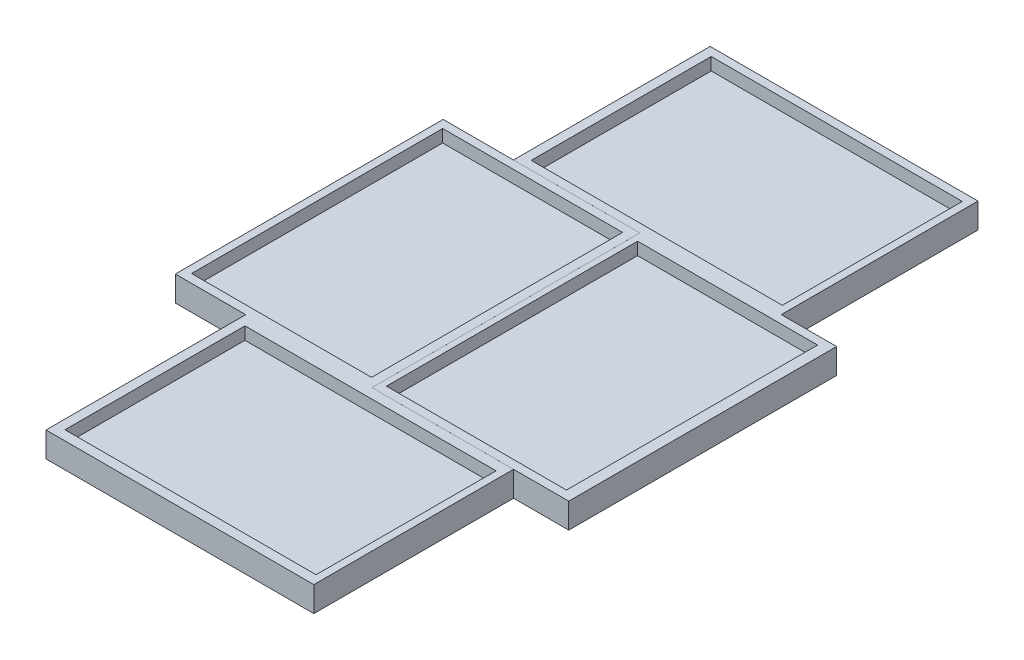
ISO-10303-21;
HEADER;
FILE_DESCRIPTION(('STEP AP214'),'2;1');
FILE_NAME('part.step','',(''),(''),'','','');
FILE_SCHEMA(('AUTOMOTIVE_DESIGN { 1 0 10303 214 1 1 1 1 }'));
ENDSEC;
DATA;
#1=APPLICATION_CONTEXT('core data for automotive mechanical design processes');
#2=APPLICATION_PROTOCOL_DEFINITION('international standard','automotive_design',2000,#1);
#3=PRODUCT_CONTEXT('',#1,'mechanical');
#4=PRODUCT('Part','Part','',(#3));
#5=PRODUCT_RELATED_PRODUCT_CATEGORY('part','',(#4));
#6=PRODUCT_DEFINITION_FORMATION('','',#4);
#7=PRODUCT_DEFINITION_CONTEXT('part definition',#1,'design');
#8=PRODUCT_DEFINITION('design','',#6,#7);
#9=PRODUCT_DEFINITION_SHAPE('','',#8);
#10=(LENGTH_UNIT() NAMED_UNIT(*) SI_UNIT(.MILLI.,.METRE.));
#11=(NAMED_UNIT(*) PLANE_ANGLE_UNIT() SI_UNIT($,.RADIAN.));
#12=(NAMED_UNIT(*) SI_UNIT($,.STERADIAN.) SOLID_ANGLE_UNIT());
#13=UNCERTAINTY_MEASURE_WITH_UNIT(LENGTH_MEASURE(1.E-05),#10,'distance_accuracy_value','');
#14=(GEOMETRIC_REPRESENTATION_CONTEXT(3) GLOBAL_UNCERTAINTY_ASSIGNED_CONTEXT((#13)) GLOBAL_UNIT_ASSIGNED_CONTEXT((#10,
#11,#12)) REPRESENTATION_CONTEXT('',''));
#15=CARTESIAN_POINT('',(0.,0.,0.));
#16=DIRECTION('',(0.,0.,1.));
#17=DIRECTION('',(1.,0.,0.));
#18=AXIS2_PLACEMENT_3D('',#15,#16,#17);
#19=CARTESIAN_POINT('',(36.3335021204187,6.,0.));
#20=DIRECTION('',(1.,0.,0.));
#21=DIRECTION('',(0.,0.,-1.));
#22=AXIS2_PLACEMENT_3D('',#19,#20,#21);
#23=PLANE('',#22);
#24=DIRECTION('',(0.,0.,1.));
#25=VECTOR('',#24,1.);
#26=CARTESIAN_POINT('',(36.3335021204187,0.,0.));
#27=LINE('',#26,#25);
#28=CARTESIAN_POINT('',(36.3335021204187,0.,52.00456736409));
#29=VERTEX_POINT('',#28);
#30=CARTESIAN_POINT('',(36.3335021204187,0.,99.7238307242931));
#31=VERTEX_POINT('',#30);
#32=EDGE_CURVE('E303',#29,#31,#27,.T.);
#33=ORIENTED_EDGE('',*,*,#32,.F.);
#34=DIRECTION('',(0.,-1.,0.));
#35=VECTOR('',#34,1.);
#36=CARTESIAN_POINT('',(36.3335021204187,6.,52.00456736409));
#37=LINE('',#36,#35);
#38=CARTESIAN_POINT('',(36.3335021204187,6.,52.00456736409));
#39=VERTEX_POINT('',#38);
#40=EDGE_CURVE('E298',#39,#29,#37,.T.);
#41=ORIENTED_EDGE('',*,*,#40,.F.);
#42=DIRECTION('',(0.,0.,1.));
#43=VECTOR('',#42,1.);
#44=CARTESIAN_POINT('',(36.3335021204187,6.,0.));
#45=LINE('',#44,#43);
#46=CARTESIAN_POINT('',(36.3335021204187,6.,99.7238307242931));
#47=VERTEX_POINT('',#46);
#48=EDGE_CURVE('E91',#39,#47,#45,.T.);
#49=ORIENTED_EDGE('',*,*,#48,.T.);
#50=DIRECTION('',(0.,-1.,0.));
#51=VECTOR('',#50,1.);
#52=CARTESIAN_POINT('',(36.3335021204187,6.,99.7238307242931));
#53=LINE('',#52,#51);
#54=EDGE_CURVE('E345',#47,#31,#53,.T.);
#55=ORIENTED_EDGE('',*,*,#54,.T.);
#56=EDGE_LOOP('',(#33,#41,#49,#55));
#57=FACE_BOUND('',#56,.T.);
#58=ADVANCED_FACE('F87',(#57),#23,.T.);
#59=CARTESIAN_POINT('',(0.,6.,52.00456736409));
#60=DIRECTION('',(0.,0.,-1.));
#61=DIRECTION('',(-1.,0.,0.));
#62=AXIS2_PLACEMENT_3D('',#59,#60,#61);
#63=PLANE('',#62);
#64=DIRECTION('',(0.,-1.,0.));
#65=VECTOR('',#64,1.);
#66=CARTESIAN_POINT('',(2.51742848786307,6.,52.00456736409));
#67=LINE('',#66,#65);
#68=CARTESIAN_POINT('',(2.51742848786307,6.,52.00456736409));
#69=VERTEX_POINT('',#68);
#70=CARTESIAN_POINT('',(2.51742848786307,0.,52.00456736409));
#71=VERTEX_POINT('',#70);
#72=EDGE_CURVE('E249',#69,#71,#67,.T.);
#73=ORIENTED_EDGE('',*,*,#72,.F.);
#74=DIRECTION('',(1.,0.,0.));
#75=VECTOR('',#74,1.);
#76=CARTESIAN_POINT('',(0.,6.,52.00456736409));
#77=LINE('',#76,#75);
#78=EDGE_CURVE('E366',#69,#39,#77,.T.);
#79=ORIENTED_EDGE('',*,*,#78,.T.);
#80=ORIENTED_EDGE('',*,*,#40,.T.);
#81=DIRECTION('',(1.,0.,0.));
#82=VECTOR('',#81,1.);
#83=CARTESIAN_POINT('',(0.,0.,52.00456736409));
#84=LINE('',#83,#82);
#85=EDGE_CURVE('E356',#71,#29,#84,.T.);
#86=ORIENTED_EDGE('',*,*,#85,.F.);
#87=EDGE_LOOP('',(#73,#79,#80,#86));
#88=FACE_BOUND('',#87,.T.);
#89=ADVANCED_FACE('F390',(#88),#63,.T.);
#90=CARTESIAN_POINT('',(-27.6664978795813,6.,0.));
#91=DIRECTION('',(1.,0.,0.));
#92=DIRECTION('',(0.,0.,-1.));
#93=AXIS2_PLACEMENT_3D('',#90,#91,#92);
#94=PLANE('',#93);
#95=DIRECTION('',(0.,0.,1.));
#96=VECTOR('',#95,1.);
#97=CARTESIAN_POINT('',(-27.6664978795813,0.,0.));
#98=LINE('',#97,#96);
#99=CARTESIAN_POINT('',(-27.6664978795813,0.,52.00456736409));
#100=VERTEX_POINT('',#99);
#101=CARTESIAN_POINT('',(-27.6664978795813,0.,99.7238307242931));
#102=VERTEX_POINT('',#101);
#103=EDGE_CURVE('E353',#100,#102,#98,.T.);
#104=ORIENTED_EDGE('',*,*,#103,.T.);
#105=DIRECTION('',(0.,-1.,0.));
#106=VECTOR('',#105,1.);
#107=CARTESIAN_POINT('',(-27.6664978795813,6.,99.7238307242931));
#108=LINE('',#107,#106);
#109=CARTESIAN_POINT('',(-27.6664978795813,6.,99.7238307242931));
#110=VERTEX_POINT('',#109);
#111=EDGE_CURVE('E341',#110,#102,#108,.T.);
#112=ORIENTED_EDGE('',*,*,#111,.F.);
#113=DIRECTION('',(0.,0.,1.));
#114=VECTOR('',#113,1.);
#115=CARTESIAN_POINT('',(-27.6664978795813,6.,0.));
#116=LINE('',#115,#114);
#117=CARTESIAN_POINT('',(-27.6664978795813,6.,52.00456736409));
#118=VERTEX_POINT('',#117);
#119=EDGE_CURVE('E364',#118,#110,#116,.T.);
#120=ORIENTED_EDGE('',*,*,#119,.F.);
#121=DIRECTION('',(0.,-1.,0.));
#122=VECTOR('',#121,1.);
#123=CARTESIAN_POINT('',(-27.6664978795813,6.,52.00456736409));
#124=LINE('',#123,#122);
#125=EDGE_CURVE('E338',#118,#100,#124,.T.);
#126=ORIENTED_EDGE('',*,*,#125,.T.);
#127=EDGE_LOOP('',(#104,#112,#120,#126));
#128=FACE_BOUND('',#127,.T.);
#129=ADVANCED_FACE('F392',(#128),#94,.F.);
#130=CARTESIAN_POINT('',(0.,6.,99.7238307242931));
#131=DIRECTION('',(0.,0.,-1.));
#132=DIRECTION('',(-1.,0.,0.));
#133=AXIS2_PLACEMENT_3D('',#130,#131,#132);
#134=PLANE('',#133);
#135=DIRECTION('',(1.,0.,0.));
#136=VECTOR('',#135,1.);
#137=CARTESIAN_POINT('',(0.,0.,99.7238307242931));
#138=LINE('',#137,#136);
#139=EDGE_CURVE('E349',#102,#31,#138,.T.);
#140=ORIENTED_EDGE('',*,*,#139,.T.);
#141=ORIENTED_EDGE('',*,*,#54,.F.);
#142=DIRECTION('',(1.,0.,0.));
#143=VECTOR('',#142,1.);
#144=CARTESIAN_POINT('',(0.,6.,99.7238307242931));
#145=LINE('',#144,#143);
#146=EDGE_CURVE('E348',#110,#47,#145,.T.);
#147=ORIENTED_EDGE('',*,*,#146,.F.);
#148=ORIENTED_EDGE('',*,*,#111,.T.);
#149=EDGE_LOOP('',(#140,#141,#147,#148));
#150=FACE_BOUND('',#149,.T.);
#151=ADVANCED_FACE('F383',(#150),#134,.F.);
#152=CARTESIAN_POINT('',(0.,6.,0.));
#153=DIRECTION('',(0.,1.,0.));
#154=DIRECTION('',(0.,0.,1.));
#155=AXIS2_PLACEMENT_3D('',#152,#153,#154);
#156=PLANE('',#155);
#157=DIRECTION('',(0.,0.,1.));
#158=VECTOR('',#157,1.);
#159=CARTESIAN_POINT('',(-25.4416036093875,6.,54.4075911091959));
#160=LINE('',#159,#158);
#161=CARTESIAN_POINT('',(-25.4416036093875,6.,54.4075911091959));
#162=VERTEX_POINT('',#161);
#163=CARTESIAN_POINT('',(-25.4416036093875,6.,97.4075911091959));
#164=VERTEX_POINT('',#163);
#165=EDGE_CURVE('E105',#162,#164,#160,.T.);
#166=ORIENTED_EDGE('',*,*,#165,.F.);
#167=DIRECTION('',(-1.,0.,0.));
#168=VECTOR('',#167,1.);
#169=CARTESIAN_POINT('',(-25.4416036093875,6.,54.4075911091959));
#170=LINE('',#169,#168);
#171=CARTESIAN_POINT('',(34.5583963906125,6.,54.4075911091959));
#172=VERTEX_POINT('',#171);
#173=EDGE_CURVE('E226',#172,#162,#170,.T.);
#174=ORIENTED_EDGE('',*,*,#173,.F.);
#175=DIRECTION('',(0.,0.,-1.));
#176=VECTOR('',#175,1.);
#177=CARTESIAN_POINT('',(34.5583963906125,6.,54.4075911091959));
#178=LINE('',#177,#176);
#179=CARTESIAN_POINT('',(34.5583963906125,6.,97.4075911091959));
#180=VERTEX_POINT('',#179);
#181=EDGE_CURVE('E230',#180,#172,#178,.T.);
#182=ORIENTED_EDGE('',*,*,#181,.F.);
#183=DIRECTION('',(1.,0.,0.));
#184=VECTOR('',#183,1.);
#185=CARTESIAN_POINT('',(-25.4416036093875,6.,97.4075911091959));
#186=LINE('',#185,#184);
#187=EDGE_CURVE('E239',#164,#180,#186,.T.);
#188=ORIENTED_EDGE('',*,*,#187,.F.);
#189=EDGE_LOOP('',(#166,#174,#182,#188));
#190=FACE_BOUND('',#189,.T.);
#191=DIRECTION('',(0.,0.,1.));
#192=VECTOR('',#191,1.);
#193=CARTESIAN_POINT('',(-42.6608354807378,6.,-10.0476670066082));
#194=LINE('',#193,#192);
#195=CARTESIAN_POINT('',(-42.6608354807378,6.,-10.0476670066082));
#196=VERTEX_POINT('',#195);
#197=CARTESIAN_POINT('',(-42.6608354807378,6.,49.9523329933918));
#198=VERTEX_POINT('',#197);
#199=EDGE_CURVE('E113',#196,#198,#194,.T.);
#200=ORIENTED_EDGE('',*,*,#199,.F.);
#201=DIRECTION('',(-1.,0.,0.));
#202=VECTOR('',#201,1.);
#203=CARTESIAN_POINT('',(-42.6608354807378,6.,-10.0476670066082));
#204=LINE('',#203,#202);
#205=CARTESIAN_POINT('',(0.339164519262178,6.,-10.0476670066082));
#206=VERTEX_POINT('',#205);
#207=EDGE_CURVE('E260',#206,#196,#204,.T.);
#208=ORIENTED_EDGE('',*,*,#207,.F.);
#209=DIRECTION('',(0.,0.,-1.));
#210=VECTOR('',#209,1.);
#211=CARTESIAN_POINT('',(0.339164519262178,6.,-10.0476670066082));
#212=LINE('',#211,#210);
#213=CARTESIAN_POINT('',(0.339164519262178,6.,49.9523329933918));
#214=VERTEX_POINT('',#213);
#215=EDGE_CURVE('E279',#214,#206,#212,.T.);
#216=ORIENTED_EDGE('',*,*,#215,.F.);
#217=DIRECTION('',(1.,0.,0.));
#218=VECTOR('',#217,1.);
#219=CARTESIAN_POINT('',(-42.6608354807378,6.,49.9523329933918));
#220=LINE('',#219,#218);
#221=EDGE_CURVE('E275',#198,#214,#220,.T.);
#222=ORIENTED_EDGE('',*,*,#221,.F.);
#223=EDGE_LOOP('',(#200,#208,#216,#222));
#224=FACE_BOUND('',#223,.T.);
#225=ORIENTED_EDGE('',*,*,#48,.F.);
#226=ORIENTED_EDGE('',*,*,#78,.F.);
#227=DIRECTION('',(0.,0.,1.));
#228=VECTOR('',#227,1.);
#229=CARTESIAN_POINT('',(2.51742848786306,6.,-11.99543263591));
#230=LINE('',#229,#228);
#231=CARTESIAN_POINT('',(2.51742848786306,6.,-11.99543263591));
#232=VERTEX_POINT('',#231);
#233=EDGE_CURVE('E328',#232,#69,#230,.T.);
#234=ORIENTED_EDGE('',*,*,#233,.F.);
#235=DIRECTION('',(1.,0.,0.));
#236=VECTOR('',#235,1.);
#237=CARTESIAN_POINT('',(-44.4825715121369,6.,-11.99543263591));
#238=LINE('',#237,#236);
#239=CARTESIAN_POINT('',(-44.4825715121369,6.,-11.99543263591));
#240=VERTEX_POINT('',#239);
#241=EDGE_CURVE('E324',#240,#232,#238,.T.);
#242=ORIENTED_EDGE('',*,*,#241,.F.);
#243=DIRECTION('',(0.,0.,1.));
#244=VECTOR('',#243,1.);
#245=CARTESIAN_POINT('',(-44.4825715121369,6.,-11.99543263591));
#246=LINE('',#245,#244);
#247=CARTESIAN_POINT('',(-44.4825715121369,6.,52.00456736409));
#248=VERTEX_POINT('',#247);
#249=EDGE_CURVE('E310',#240,#248,#246,.T.);
#250=ORIENTED_EDGE('',*,*,#249,.T.);
#251=DIRECTION('',(1.,0.,0.));
#252=VECTOR('',#251,1.);
#253=CARTESIAN_POINT('',(-44.4825715121369,6.,52.00456736409));
#254=LINE('',#253,#252);
#255=EDGE_CURVE('E315',#248,#118,#254,.T.);
#256=ORIENTED_EDGE('',*,*,#255,.T.);
#257=ORIENTED_EDGE('',*,*,#119,.T.);
#258=ORIENTED_EDGE('',*,*,#146,.T.);
#259=EDGE_LOOP('',(#225,#226,#234,#242,#250,#256,#257,#258));
#260=FACE_BOUND('',#259,.T.);
#261=ADVANCED_FACE('F89',(#190,#224,#260),#156,.T.);
#262=CARTESIAN_POINT('',(0.,0.,0.));
#263=DIRECTION('',(0.,1.,0.));
#264=DIRECTION('',(0.,0.,1.));
#265=AXIS2_PLACEMENT_3D('',#262,#263,#264);
#266=PLANE('',#265);
#267=ORIENTED_EDGE('',*,*,#32,.T.);
#268=ORIENTED_EDGE('',*,*,#139,.F.);
#269=ORIENTED_EDGE('',*,*,#103,.F.);
#270=DIRECTION('',(1.,0.,0.));
#271=VECTOR('',#270,1.);
#272=CARTESIAN_POINT('',(-44.4825715121369,0.,52.00456736409));
#273=LINE('',#272,#271);
#274=CARTESIAN_POINT('',(-44.4825715121369,0.,52.00456736409));
#275=VERTEX_POINT('',#274);
#276=EDGE_CURVE('E13',#275,#100,#273,.T.);
#277=ORIENTED_EDGE('',*,*,#276,.F.);
#278=DIRECTION('',(0.,0.,1.));
#279=VECTOR('',#278,1.);
#280=CARTESIAN_POINT('',(-44.4825715121369,0.,-11.99543263591));
#281=LINE('',#280,#279);
#282=CARTESIAN_POINT('',(-44.4825715121369,0.,-11.99543263591));
#283=VERTEX_POINT('',#282);
#284=EDGE_CURVE('E311',#283,#275,#281,.T.);
#285=ORIENTED_EDGE('',*,*,#284,.F.);
#286=DIRECTION('',(1.,0.,0.));
#287=VECTOR('',#286,1.);
#288=CARTESIAN_POINT('',(-44.4825715121369,0.,-11.99543263591));
#289=LINE('',#288,#287);
#290=CARTESIAN_POINT('',(2.51742848786306,0.,-11.99543263591));
#291=VERTEX_POINT('',#290);
#292=EDGE_CURVE('E314',#283,#291,#289,.T.);
#293=ORIENTED_EDGE('',*,*,#292,.T.);
#294=DIRECTION('',(0.,0.,1.));
#295=VECTOR('',#294,1.);
#296=CARTESIAN_POINT('',(2.51742848786306,0.,-11.99543263591));
#297=LINE('',#296,#295);
#298=EDGE_CURVE('E97',#291,#71,#297,.T.);
#299=ORIENTED_EDGE('',*,*,#298,.T.);
#300=ORIENTED_EDGE('',*,*,#85,.T.);
#301=EDGE_LOOP('',(#267,#268,#269,#277,#285,#293,#299,#300));
#302=FACE_BOUND('',#301,.T.);
#303=ADVANCED_FACE('F387',(#302),#266,.F.);
#304=CARTESIAN_POINT('',(-44.4825715121369,6.,-11.99543263591));
#305=DIRECTION('',(1.,0.,0.));
#306=DIRECTION('',(0.,0.,-1.));
#307=AXIS2_PLACEMENT_3D('',#304,#305,#306);
#308=PLANE('',#307);
#309=ORIENTED_EDGE('',*,*,#284,.T.);
#310=DIRECTION('',(0.,-1.,0.));
#311=VECTOR('',#310,1.);
#312=CARTESIAN_POINT('',(-44.4825715121369,6.,52.00456736409));
#313=LINE('',#312,#311);
#314=EDGE_CURVE('E306',#248,#275,#313,.T.);
#315=ORIENTED_EDGE('',*,*,#314,.F.);
#316=ORIENTED_EDGE('',*,*,#249,.F.);
#317=DIRECTION('',(0.,-1.,0.));
#318=VECTOR('',#317,1.);
#319=CARTESIAN_POINT('',(-44.4825715121369,6.,-11.99543263591));
#320=LINE('',#319,#318);
#321=EDGE_CURVE('E302',#240,#283,#320,.T.);
#322=ORIENTED_EDGE('',*,*,#321,.T.);
#323=EDGE_LOOP('',(#309,#315,#316,#322));
#324=FACE_BOUND('',#323,.T.);
#325=ADVANCED_FACE('F401',(#324),#308,.F.);
#326=CARTESIAN_POINT('',(-44.4825715121369,6.,-11.99543263591));
#327=DIRECTION('',(0.,0.,-1.));
#328=DIRECTION('',(-1.,0.,0.));
#329=AXIS2_PLACEMENT_3D('',#326,#327,#328);
#330=PLANE('',#329);
#331=ORIENTED_EDGE('',*,*,#292,.F.);
#332=ORIENTED_EDGE('',*,*,#321,.F.);
#333=ORIENTED_EDGE('',*,*,#241,.T.);
#334=DIRECTION('',(0.,-1.,0.));
#335=VECTOR('',#334,1.);
#336=CARTESIAN_POINT('',(2.51742848786306,6.,-11.99543263591));
#337=LINE('',#336,#335);
#338=EDGE_CURVE('E299',#232,#291,#337,.T.);
#339=ORIENTED_EDGE('',*,*,#338,.T.);
#340=EDGE_LOOP('',(#331,#332,#333,#339));
#341=FACE_BOUND('',#340,.T.);
#342=ADVANCED_FACE('F414',(#341),#330,.T.);
#343=CARTESIAN_POINT('',(2.51742848786306,6.,-11.99543263591));
#344=DIRECTION('',(1.,0.,0.));
#345=DIRECTION('',(0.,0.,-1.));
#346=AXIS2_PLACEMENT_3D('',#343,#344,#345);
#347=PLANE('',#346);
#348=ORIENTED_EDGE('',*,*,#298,.F.);
#349=ORIENTED_EDGE('',*,*,#338,.F.);
#350=ORIENTED_EDGE('',*,*,#233,.T.);
#351=ORIENTED_EDGE('',*,*,#72,.T.);
#352=EDGE_LOOP('',(#348,#349,#350,#351));
#353=FACE_BOUND('',#352,.T.);
#354=ADVANCED_FACE('F405',(#353),#347,.T.);
#355=CARTESIAN_POINT('',(-44.4825715121369,6.,52.00456736409));
#356=DIRECTION('',(0.,0.,-1.));
#357=DIRECTION('',(-1.,0.,0.));
#358=AXIS2_PLACEMENT_3D('',#355,#356,#357);
#359=PLANE('',#358);
#360=ORIENTED_EDGE('',*,*,#125,.F.);
#361=ORIENTED_EDGE('',*,*,#255,.F.);
#362=ORIENTED_EDGE('',*,*,#314,.T.);
#363=ORIENTED_EDGE('',*,*,#276,.T.);
#364=EDGE_LOOP('',(#360,#361,#362,#363));
#365=FACE_BOUND('',#364,.T.);
#366=ADVANCED_FACE('F402',(#365),#359,.F.);
#367=CARTESIAN_POINT('',(-42.6608354807378,3.,-10.0476670066082));
#368=DIRECTION('',(-1.,0.,0.));
#369=DIRECTION('',(0.,0.,1.));
#370=AXIS2_PLACEMENT_3D('',#367,#368,#369);
#371=PLANE('',#370);
#372=ORIENTED_EDGE('',*,*,#199,.T.);
#373=DIRECTION('',(0.,1.,0.));
#374=VECTOR('',#373,1.);
#375=CARTESIAN_POINT('',(-42.6608354807378,3.,49.9523329933918));
#376=LINE('',#375,#374);
#377=CARTESIAN_POINT('',(-42.6608354807378,3.,49.9523329933918));
#378=VERTEX_POINT('',#377);
#379=EDGE_CURVE('E272',#378,#198,#376,.T.);
#380=ORIENTED_EDGE('',*,*,#379,.F.);
#381=DIRECTION('',(0.,0.,1.));
#382=VECTOR('',#381,1.);
#383=CARTESIAN_POINT('',(-42.6608354807378,3.,-10.0476670066082));
#384=LINE('',#383,#382);
#385=CARTESIAN_POINT('',(-42.6608354807378,3.,-10.0476670066082));
#386=VERTEX_POINT('',#385);
#387=EDGE_CURVE('E255',#386,#378,#384,.T.);
#388=ORIENTED_EDGE('',*,*,#387,.F.);
#389=DIRECTION('',(0.,1.,0.));
#390=VECTOR('',#389,1.);
#391=CARTESIAN_POINT('',(-42.6608354807378,3.,-10.0476670066082));
#392=LINE('',#391,#390);
#393=EDGE_CURVE('E240',#386,#196,#392,.T.);
#394=ORIENTED_EDGE('',*,*,#393,.T.);
#395=EDGE_LOOP('',(#372,#380,#388,#394));
#396=FACE_BOUND('',#395,.T.);
#397=ADVANCED_FACE('F404',(#396),#371,.F.);
#398=CARTESIAN_POINT('',(-42.6608354807378,3.,-10.0476670066082));
#399=DIRECTION('',(0.,0.,-1.));
#400=DIRECTION('',(-1.,0.,0.));
#401=AXIS2_PLACEMENT_3D('',#398,#399,#400);
#402=PLANE('',#401);
#403=ORIENTED_EDGE('',*,*,#207,.T.);
#404=ORIENTED_EDGE('',*,*,#393,.F.);
#405=DIRECTION('',(-1.,0.,0.));
#406=VECTOR('',#405,1.);
#407=CARTESIAN_POINT('',(-42.6608354807378,3.,-10.0476670066082));
#408=LINE('',#407,#406);
#409=CARTESIAN_POINT('',(0.339164519262178,3.,-10.0476670066082));
#410=VERTEX_POINT('',#409);
#411=EDGE_CURVE('E268',#410,#386,#408,.T.);
#412=ORIENTED_EDGE('',*,*,#411,.F.);
#413=DIRECTION('',(0.,1.,0.));
#414=VECTOR('',#413,1.);
#415=CARTESIAN_POINT('',(0.339164519262178,3.,-10.0476670066082));
#416=LINE('',#415,#414);
#417=EDGE_CURVE('E288',#410,#206,#416,.T.);
#418=ORIENTED_EDGE('',*,*,#417,.T.);
#419=EDGE_LOOP('',(#403,#404,#412,#418));
#420=FACE_BOUND('',#419,.T.);
#421=ADVANCED_FACE('F412',(#420),#402,.F.);
#422=CARTESIAN_POINT('',(0.339164519262178,3.,-10.0476670066082));
#423=DIRECTION('',(1.,0.,0.));
#424=DIRECTION('',(0.,0.,-1.));
#425=AXIS2_PLACEMENT_3D('',#422,#423,#424);
#426=PLANE('',#425);
#427=ORIENTED_EDGE('',*,*,#215,.T.);
#428=ORIENTED_EDGE('',*,*,#417,.F.);
#429=DIRECTION('',(0.,0.,-1.));
#430=VECTOR('',#429,1.);
#431=CARTESIAN_POINT('',(0.339164519262178,3.,-10.0476670066082));
#432=LINE('',#431,#430);
#433=CARTESIAN_POINT('',(0.339164519262178,3.,49.9523329933918));
#434=VERTEX_POINT('',#433);
#435=EDGE_CURVE('E264',#434,#410,#432,.T.);
#436=ORIENTED_EDGE('',*,*,#435,.F.);
#437=DIRECTION('',(0.,1.,0.));
#438=VECTOR('',#437,1.);
#439=CARTESIAN_POINT('',(0.339164519262178,3.,49.9523329933918));
#440=LINE('',#439,#438);
#441=EDGE_CURVE('E291',#434,#214,#440,.T.);
#442=ORIENTED_EDGE('',*,*,#441,.T.);
#443=EDGE_LOOP('',(#427,#428,#436,#442));
#444=FACE_BOUND('',#443,.T.);
#445=ADVANCED_FACE('F467',(#444),#426,.F.);
#446=CARTESIAN_POINT('',(-42.6608354807378,3.,49.9523329933918));
#447=DIRECTION('',(0.,0.,1.));
#448=DIRECTION('',(1.,0.,0.));
#449=AXIS2_PLACEMENT_3D('',#446,#447,#448);
#450=PLANE('',#449);
#451=ORIENTED_EDGE('',*,*,#221,.T.);
#452=ORIENTED_EDGE('',*,*,#441,.F.);
#453=DIRECTION('',(1.,0.,0.));
#454=VECTOR('',#453,1.);
#455=CARTESIAN_POINT('',(-42.6608354807378,3.,49.9523329933918));
#456=LINE('',#455,#454);
#457=EDGE_CURVE('E259',#378,#434,#456,.T.);
#458=ORIENTED_EDGE('',*,*,#457,.F.);
#459=ORIENTED_EDGE('',*,*,#379,.T.);
#460=EDGE_LOOP('',(#451,#452,#458,#459));
#461=FACE_BOUND('',#460,.T.);
#462=ADVANCED_FACE('F477',(#461),#450,.F.);
#463=CARTESIAN_POINT('',(0.,3.,0.));
#464=DIRECTION('',(0.,1.,0.));
#465=DIRECTION('',(0.,0.,1.));
#466=AXIS2_PLACEMENT_3D('',#463,#464,#465);
#467=PLANE('',#466);
#468=ORIENTED_EDGE('',*,*,#387,.T.);
#469=ORIENTED_EDGE('',*,*,#457,.T.);
#470=ORIENTED_EDGE('',*,*,#435,.T.);
#471=ORIENTED_EDGE('',*,*,#411,.T.);
#472=EDGE_LOOP('',(#468,#469,#470,#471));
#473=FACE_BOUND('',#472,.T.);
#474=ADVANCED_FACE('F487',(#473),#467,.T.);
#475=CARTESIAN_POINT('',(-25.4416036093875,3.,54.4075911091959));
#476=DIRECTION('',(-1.,0.,0.));
#477=DIRECTION('',(0.,0.,1.));
#478=AXIS2_PLACEMENT_3D('',#475,#476,#477);
#479=PLANE('',#478);
#480=ORIENTED_EDGE('',*,*,#165,.T.);
#481=DIRECTION('',(0.,1.,0.));
#482=VECTOR('',#481,1.);
#483=CARTESIAN_POINT('',(-25.4416036093875,3.,97.4075911091959));
#484=LINE('',#483,#482);
#485=CARTESIAN_POINT('',(-25.4416036093875,3.,97.4075911091959));
#486=VERTEX_POINT('',#485);
#487=EDGE_CURVE('E201',#486,#164,#484,.T.);
#488=ORIENTED_EDGE('',*,*,#487,.F.);
#489=DIRECTION('',(0.,0.,1.));
#490=VECTOR('',#489,1.);
#491=CARTESIAN_POINT('',(-25.4416036093875,3.,54.4075911091959));
#492=LINE('',#491,#490);
#493=CARTESIAN_POINT('',(-25.4416036093875,3.,54.4075911091959));
#494=VERTEX_POINT('',#493);
#495=EDGE_CURVE('E205',#494,#486,#492,.T.);
#496=ORIENTED_EDGE('',*,*,#495,.F.);
#497=DIRECTION('',(0.,1.,0.));
#498=VECTOR('',#497,1.);
#499=CARTESIAN_POINT('',(-25.4416036093875,3.,54.4075911091959));
#500=LINE('',#499,#498);
#501=EDGE_CURVE('E246',#494,#162,#500,.T.);
#502=ORIENTED_EDGE('',*,*,#501,.T.);
#503=EDGE_LOOP('',(#480,#488,#496,#502));
#504=FACE_BOUND('',#503,.T.);
#505=ADVANCED_FACE('F203',(#504),#479,.F.);
#506=CARTESIAN_POINT('',(-25.4416036093875,3.,54.4075911091959));
#507=DIRECTION('',(0.,0.,-1.));
#508=DIRECTION('',(-1.,0.,0.));
#509=AXIS2_PLACEMENT_3D('',#506,#507,#508);
#510=PLANE('',#509);
#511=ORIENTED_EDGE('',*,*,#173,.T.);
#512=ORIENTED_EDGE('',*,*,#501,.F.);
#513=DIRECTION('',(-1.,0.,0.));
#514=VECTOR('',#513,1.);
#515=CARTESIAN_POINT('',(-25.4416036093875,3.,54.4075911091959));
#516=LINE('',#515,#514);
#517=CARTESIAN_POINT('',(34.5583963906125,3.,54.4075911091959));
#518=VERTEX_POINT('',#517);
#519=EDGE_CURVE('E212',#518,#494,#516,.T.);
#520=ORIENTED_EDGE('',*,*,#519,.F.);
#521=DIRECTION('',(0.,1.,0.));
#522=VECTOR('',#521,1.);
#523=CARTESIAN_POINT('',(34.5583963906125,3.,54.4075911091959));
#524=LINE('',#523,#522);
#525=EDGE_CURVE('E250',#518,#172,#524,.T.);
#526=ORIENTED_EDGE('',*,*,#525,.T.);
#527=EDGE_LOOP('',(#511,#512,#520,#526));
#528=FACE_BOUND('',#527,.T.);
#529=ADVANCED_FACE('F505',(#528),#510,.F.);
#530=CARTESIAN_POINT('',(34.5583963906125,3.,54.4075911091959));
#531=DIRECTION('',(1.,0.,0.));
#532=DIRECTION('',(0.,0.,-1.));
#533=AXIS2_PLACEMENT_3D('',#530,#531,#532);
#534=PLANE('',#533);
#535=ORIENTED_EDGE('',*,*,#181,.T.);
#536=ORIENTED_EDGE('',*,*,#525,.F.);
#537=DIRECTION('',(0.,0.,-1.));
#538=VECTOR('',#537,1.);
#539=CARTESIAN_POINT('',(34.5583963906125,3.,54.4075911091959));
#540=LINE('',#539,#538);
#541=CARTESIAN_POINT('',(34.5583963906125,3.,97.4075911091959));
#542=VERTEX_POINT('',#541);
#543=EDGE_CURVE('E221',#542,#518,#540,.T.);
#544=ORIENTED_EDGE('',*,*,#543,.F.);
#545=DIRECTION('',(0.,1.,0.));
#546=VECTOR('',#545,1.);
#547=CARTESIAN_POINT('',(34.5583963906125,3.,97.4075911091959));
#548=LINE('',#547,#546);
#549=EDGE_CURVE('E211',#542,#180,#548,.T.);
#550=ORIENTED_EDGE('',*,*,#549,.T.);
#551=EDGE_LOOP('',(#535,#536,#544,#550));
#552=FACE_BOUND('',#551,.T.);
#553=ADVANCED_FACE('F514',(#552),#534,.F.);
#554=CARTESIAN_POINT('',(-25.4416036093875,3.,97.4075911091959));
#555=DIRECTION('',(0.,0.,1.));
#556=DIRECTION('',(1.,0.,0.));
#557=AXIS2_PLACEMENT_3D('',#554,#555,#556);
#558=PLANE('',#557);
#559=ORIENTED_EDGE('',*,*,#187,.T.);
#560=ORIENTED_EDGE('',*,*,#549,.F.);
#561=DIRECTION('',(1.,0.,0.));
#562=VECTOR('',#561,1.);
#563=CARTESIAN_POINT('',(-25.4416036093875,3.,97.4075911091959));
#564=LINE('',#563,#562);
#565=EDGE_CURVE('E215',#486,#542,#564,.T.);
#566=ORIENTED_EDGE('',*,*,#565,.F.);
#567=ORIENTED_EDGE('',*,*,#487,.T.);
#568=EDGE_LOOP('',(#559,#560,#566,#567));
#569=FACE_BOUND('',#568,.T.);
#570=ADVANCED_FACE('F216',(#569),#558,.F.);
#571=CARTESIAN_POINT('',(0.,3.,0.));
#572=DIRECTION('',(0.,1.,0.));
#573=DIRECTION('',(0.,0.,1.));
#574=AXIS2_PLACEMENT_3D('',#571,#572,#573);
#575=PLANE('',#574);
#576=ORIENTED_EDGE('',*,*,#495,.T.);
#577=ORIENTED_EDGE('',*,*,#565,.T.);
#578=ORIENTED_EDGE('',*,*,#543,.T.);
#579=ORIENTED_EDGE('',*,*,#519,.T.);
#580=EDGE_LOOP('',(#576,#577,#578,#579));
#581=FACE_BOUND('',#580,.T.);
#582=ADVANCED_FACE('F223',(#581),#575,.T.);
#583=CLOSED_SHELL('',(#58,#89,#129,#151,#261,#303,#325,#342,#354,#366,#397,#421,#445,#462,#474,
#505,#529,#553,#570,#582));
#584=MANIFOLD_SOLID_BREP('B2',#583);
#585=CARTESIAN_POINT('',(36.3101263270123,6.,0.));
#586=DIRECTION('',(1.,0.,0.));
#587=DIRECTION('',(0.,0.,-1.));
#588=AXIS2_PLACEMENT_3D('',#585,#586,#587);
#589=PLANE('',#588);
#590=DIRECTION('',(0.,0.,1.));
#591=VECTOR('',#590,1.);
#592=CARTESIAN_POINT('',(36.3101263270123,0.,0.));
#593=LINE('',#592,#591);
#594=CARTESIAN_POINT('',(36.3101263270123,0.,-58.9971933173167));
#595=VERTEX_POINT('',#594);
#596=CARTESIAN_POINT('',(36.3101263270123,0.,-11.9971933173167));
#597=VERTEX_POINT('',#596);
#598=EDGE_CURVE('E743',#595,#597,#593,.T.);
#599=ORIENTED_EDGE('',*,*,#598,.F.);
#600=DIRECTION('',(0.,-1.,0.));
#601=VECTOR('',#600,1.);
#602=CARTESIAN_POINT('',(36.3101263270123,6.,-58.9971933173167));
#603=LINE('',#602,#601);
#604=CARTESIAN_POINT('',(36.3101263270123,6.,-58.9971933173167));
#605=VERTEX_POINT('',#604);
#606=EDGE_CURVE('E85',#605,#595,#603,.T.);
#607=ORIENTED_EDGE('',*,*,#606,.F.);
#608=DIRECTION('',(0.,0.,1.));
#609=VECTOR('',#608,1.);
#610=CARTESIAN_POINT('',(36.3101263270123,6.,0.));
#611=LINE('',#610,#609);
#612=CARTESIAN_POINT('',(36.3101263270123,6.,-11.9971933173167));
#613=VERTEX_POINT('',#612);
#614=EDGE_CURVE('E776',#605,#613,#611,.T.);
#615=ORIENTED_EDGE('',*,*,#614,.T.);
#616=DIRECTION('',(0.,-1.,0.));
#617=VECTOR('',#616,1.);
#618=CARTESIAN_POINT('',(36.3101263270123,6.,-11.9971933173167));
#619=LINE('',#618,#617);
#620=EDGE_CURVE('E797',#613,#597,#619,.T.);
#621=ORIENTED_EDGE('',*,*,#620,.T.);
#622=EDGE_LOOP('',(#599,#607,#615,#621));
#623=FACE_BOUND('',#622,.T.);
#624=ADVANCED_FACE('F596',(#623),#589,.T.);
#625=CARTESIAN_POINT('',(0.,6.,-58.9971933173167));
#626=DIRECTION('',(0.,0.,-1.));
#627=DIRECTION('',(-1.,0.,0.));
#628=AXIS2_PLACEMENT_3D('',#625,#626,#627);
#629=PLANE('',#628);
#630=DIRECTION('',(1.,0.,0.));
#631=VECTOR('',#630,1.);
#632=CARTESIAN_POINT('',(0.,0.,-58.9971933173167));
#633=LINE('',#632,#631);
#634=CARTESIAN_POINT('',(-27.6898736729877,0.,-58.9971933173167));
#635=VERTEX_POINT('',#634);
#636=EDGE_CURVE('E800',#635,#595,#633,.T.);
#637=ORIENTED_EDGE('',*,*,#636,.F.);
#638=DIRECTION('',(0.,-1.,0.));
#639=VECTOR('',#638,1.);
#640=CARTESIAN_POINT('',(-27.6898736729877,6.,-58.9971933173167));
#641=LINE('',#640,#639);
#642=CARTESIAN_POINT('',(-27.6898736729877,6.,-58.9971933173167));
#643=VERTEX_POINT('',#642);
#644=EDGE_CURVE('E603',#643,#635,#641,.T.);
#645=ORIENTED_EDGE('',*,*,#644,.F.);
#646=DIRECTION('',(1.,0.,0.));
#647=VECTOR('',#646,1.);
#648=CARTESIAN_POINT('',(0.,6.,-58.9971933173167));
#649=LINE('',#648,#647);
#650=EDGE_CURVE('E779',#643,#605,#649,.T.);
#651=ORIENTED_EDGE('',*,*,#650,.T.);
#652=ORIENTED_EDGE('',*,*,#606,.T.);
#653=EDGE_LOOP('',(#637,#645,#651,#652));
#654=FACE_BOUND('',#653,.T.);
#655=ADVANCED_FACE('F842',(#654),#629,.T.);
#656=CARTESIAN_POINT('',(-27.6898736729877,6.,0.));
#657=DIRECTION('',(1.,0.,0.));
#658=DIRECTION('',(0.,0.,-1.));
#659=AXIS2_PLACEMENT_3D('',#656,#657,#658);
#660=PLANE('',#659);
#661=DIRECTION('',(0.,0.,1.));
#662=VECTOR('',#661,1.);
#663=CARTESIAN_POINT('',(-27.6898736729877,0.,0.));
#664=LINE('',#663,#662);
#665=CARTESIAN_POINT('',(-27.6898736729877,0.,-11.9971933173167));
#666=VERTEX_POINT('',#665);
#667=EDGE_CURVE('E803',#635,#666,#664,.T.);
#668=ORIENTED_EDGE('',*,*,#667,.T.);
#669=DIRECTION('',(0.,-1.,0.));
#670=VECTOR('',#669,1.);
#671=CARTESIAN_POINT('',(-27.6898736729877,6.,-11.9971933173167));
#672=LINE('',#671,#670);
#673=CARTESIAN_POINT('',(-27.6898736729877,6.,-11.9971933173167));
#674=VERTEX_POINT('',#673);
#675=EDGE_CURVE('E828',#674,#666,#672,.T.);
#676=ORIENTED_EDGE('',*,*,#675,.F.);
#677=DIRECTION('',(0.,0.,1.));
#678=VECTOR('',#677,1.);
#679=CARTESIAN_POINT('',(-27.6898736729877,6.,0.));
#680=LINE('',#679,#678);
#681=EDGE_CURVE('E783',#643,#674,#680,.T.);
#682=ORIENTED_EDGE('',*,*,#681,.F.);
#683=ORIENTED_EDGE('',*,*,#644,.T.);
#684=EDGE_LOOP('',(#668,#676,#682,#683));
#685=FACE_BOUND('',#684,.T.);
#686=ADVANCED_FACE('F833',(#685),#660,.F.);
#687=CARTESIAN_POINT('',(0.,6.,-11.9971933173167));
#688=DIRECTION('',(0.,0.,-1.));
#689=DIRECTION('',(-1.,0.,0.));
#690=AXIS2_PLACEMENT_3D('',#687,#688,#689);
#691=PLANE('',#690);
#692=DIRECTION('',(1.,0.,0.));
#693=VECTOR('',#692,1.);
#694=CARTESIAN_POINT('',(0.,0.,-11.9971933173167));
#695=LINE('',#694,#693);
#696=CARTESIAN_POINT('',(2.51905361517359,0.,-11.9971933173167));
#697=VERTEX_POINT('',#696);
#698=EDGE_CURVE('E805',#666,#697,#695,.T.);
#699=ORIENTED_EDGE('',*,*,#698,.T.);
#700=DIRECTION('',(0.,-1.,0.));
#701=VECTOR('',#700,1.);
#702=CARTESIAN_POINT('',(2.51905361517359,6.,-11.9971933173167));
#703=LINE('',#702,#701);
#704=CARTESIAN_POINT('',(2.51905361517359,6.,-11.9971933173167));
#705=VERTEX_POINT('',#704);
#706=EDGE_CURVE('E825',#705,#697,#703,.T.);
#707=ORIENTED_EDGE('',*,*,#706,.F.);
#708=DIRECTION('',(1.,0.,0.));
#709=VECTOR('',#708,1.);
#710=CARTESIAN_POINT('',(0.,6.,-11.9971933173167));
#711=LINE('',#710,#709);
#712=EDGE_CURVE('E785',#674,#705,#711,.T.);
#713=ORIENTED_EDGE('',*,*,#712,.F.);
#714=ORIENTED_EDGE('',*,*,#675,.T.);
#715=EDGE_LOOP('',(#699,#707,#713,#714));
#716=FACE_BOUND('',#715,.T.);
#717=ADVANCED_FACE('F866',(#716),#691,.F.);
#718=CARTESIAN_POINT('',(2.51905361517359,6.,0.));
#719=DIRECTION('',(1.,0.,0.));
#720=DIRECTION('',(0.,0.,-1.));
#721=AXIS2_PLACEMENT_3D('',#718,#719,#720);
#722=PLANE('',#721);
#723=DIRECTION('',(0.,0.,1.));
#724=VECTOR('',#723,1.);
#725=CARTESIAN_POINT('',(2.51905361517359,0.,0.));
#726=LINE('',#725,#724);
#727=CARTESIAN_POINT('',(2.5190536151736,0.,52.0028066826833));
#728=VERTEX_POINT('',#727);
#729=EDGE_CURVE('E807',#697,#728,#726,.T.);
#730=ORIENTED_EDGE('',*,*,#729,.T.);
#731=DIRECTION('',(0.,-1.,0.));
#732=VECTOR('',#731,1.);
#733=CARTESIAN_POINT('',(2.5190536151736,6.,52.0028066826833));
#734=LINE('',#733,#732);
#735=CARTESIAN_POINT('',(2.5190536151736,6.,52.0028066826833));
#736=VERTEX_POINT('',#735);
#737=EDGE_CURVE('E822',#736,#728,#734,.T.);
#738=ORIENTED_EDGE('',*,*,#737,.F.);
#739=DIRECTION('',(0.,0.,1.));
#740=VECTOR('',#739,1.);
#741=CARTESIAN_POINT('',(2.51905361517359,6.,0.));
#742=LINE('',#741,#740);
#743=EDGE_CURVE('E787',#705,#736,#742,.T.);
#744=ORIENTED_EDGE('',*,*,#743,.F.);
#745=ORIENTED_EDGE('',*,*,#706,.T.);
#746=EDGE_LOOP('',(#730,#738,#744,#745));
#747=FACE_BOUND('',#746,.T.);
#748=ADVANCED_FACE('F862',(#747),#722,.F.);
#749=CARTESIAN_POINT('',(0.,6.,52.0028066826833));
#750=DIRECTION('',(0.,0.,-1.));
#751=DIRECTION('',(-1.,0.,0.));
#752=AXIS2_PLACEMENT_3D('',#749,#750,#751);
#753=PLANE('',#752);
#754=DIRECTION('',(1.,0.,0.));
#755=VECTOR('',#754,1.);
#756=CARTESIAN_POINT('',(0.,0.,52.0028066826833));
#757=LINE('',#756,#755);
#758=CARTESIAN_POINT('',(49.5190536151736,0.,52.0028066826833));
#759=VERTEX_POINT('',#758);
#760=EDGE_CURVE('E809',#728,#759,#757,.T.);
#761=ORIENTED_EDGE('',*,*,#760,.T.);
#762=DIRECTION('',(0.,-1.,0.));
#763=VECTOR('',#762,1.);
#764=CARTESIAN_POINT('',(49.5190536151736,6.,52.0028066826833));
#765=LINE('',#764,#763);
#766=CARTESIAN_POINT('',(49.5190536151736,6.,52.0028066826833));
#767=VERTEX_POINT('',#766);
#768=EDGE_CURVE('E820',#767,#759,#765,.T.);
#769=ORIENTED_EDGE('',*,*,#768,.F.);
#770=DIRECTION('',(1.,0.,0.));
#771=VECTOR('',#770,1.);
#772=CARTESIAN_POINT('',(0.,6.,52.0028066826833));
#773=LINE('',#772,#771);
#774=EDGE_CURVE('E789',#736,#767,#773,.T.);
#775=ORIENTED_EDGE('',*,*,#774,.F.);
#776=ORIENTED_EDGE('',*,*,#737,.T.);
#777=EDGE_LOOP('',(#761,#769,#775,#776));
#778=FACE_BOUND('',#777,.T.);
#779=ADVANCED_FACE('F857',(#778),#753,.F.);
#780=CARTESIAN_POINT('',(49.5190536151736,6.,0.));
#781=DIRECTION('',(1.,0.,0.));
#782=DIRECTION('',(0.,0.,-1.));
#783=AXIS2_PLACEMENT_3D('',#780,#781,#782);
#784=PLANE('',#783);
#785=DIRECTION('',(0.,0.,1.));
#786=VECTOR('',#785,1.);
#787=CARTESIAN_POINT('',(49.5190536151736,0.,0.));
#788=LINE('',#787,#786);
#789=CARTESIAN_POINT('',(49.5190536151736,0.,-11.9971933173167));
#790=VERTEX_POINT('',#789);
#791=EDGE_CURVE('E812',#790,#759,#788,.T.);
#792=ORIENTED_EDGE('',*,*,#791,.F.);
#793=DIRECTION('',(0.,-1.,0.));
#794=VECTOR('',#793,1.);
#795=CARTESIAN_POINT('',(49.5190536151736,6.,-11.9971933173167));
#796=LINE('',#795,#794);
#797=CARTESIAN_POINT('',(49.5190536151736,6.,-11.9971933173167));
#798=VERTEX_POINT('',#797);
#799=EDGE_CURVE('E818',#798,#790,#796,.T.);
#800=ORIENTED_EDGE('',*,*,#799,.F.);
#801=DIRECTION('',(0.,0.,1.));
#802=VECTOR('',#801,1.);
#803=CARTESIAN_POINT('',(49.5190536151736,6.,0.));
#804=LINE('',#803,#802);
#805=EDGE_CURVE('E791',#798,#767,#804,.T.);
#806=ORIENTED_EDGE('',*,*,#805,.T.);
#807=ORIENTED_EDGE('',*,*,#768,.T.);
#808=EDGE_LOOP('',(#792,#800,#806,#807));
#809=FACE_BOUND('',#808,.T.);
#810=ADVANCED_FACE('F853',(#809),#784,.T.);
#811=CARTESIAN_POINT('',(0.,6.,-11.9971933173167));
#812=DIRECTION('',(0.,0.,-1.));
#813=DIRECTION('',(-1.,0.,0.));
#814=AXIS2_PLACEMENT_3D('',#811,#812,#813);
#815=PLANE('',#814);
#816=DIRECTION('',(1.,0.,0.));
#817=VECTOR('',#816,1.);
#818=CARTESIAN_POINT('',(0.,0.,-11.9971933173167));
#819=LINE('',#818,#817);
#820=EDGE_CURVE('E780',#597,#790,#819,.T.);
#821=ORIENTED_EDGE('',*,*,#820,.F.);
#822=ORIENTED_EDGE('',*,*,#620,.F.);
#823=DIRECTION('',(1.,0.,0.));
#824=VECTOR('',#823,1.);
#825=CARTESIAN_POINT('',(0.,6.,-11.9971933173167));
#826=LINE('',#825,#824);
#827=EDGE_CURVE('E794',#613,#798,#826,.T.);
#828=ORIENTED_EDGE('',*,*,#827,.T.);
#829=ORIENTED_EDGE('',*,*,#799,.T.);
#830=EDGE_LOOP('',(#821,#822,#828,#829));
#831=FACE_BOUND('',#830,.T.);
#832=ADVANCED_FACE('F848',(#831),#815,.T.);
#833=CARTESIAN_POINT('',(0.,6.,0.));
#834=DIRECTION('',(0.,1.,0.));
#835=DIRECTION('',(0.,0.,1.));
#836=AXIS2_PLACEMENT_3D('',#833,#834,#835);
#837=PLANE('',#836);
#838=DIRECTION('',(0.,0.,1.));
#839=VECTOR('',#838,1.);
#840=CARTESIAN_POINT('',(-25.481030039885,6.,-57.0388934069507));
#841=LINE('',#840,#839);
#842=CARTESIAN_POINT('',(-25.481030039885,6.,-57.0388934069507));
#843=VERTEX_POINT('',#842);
#844=CARTESIAN_POINT('',(-25.481030039885,6.,-14.0388934069507));
#845=VERTEX_POINT('',#844);
#846=EDGE_CURVE('E610',#843,#845,#841,.T.);
#847=ORIENTED_EDGE('',*,*,#846,.F.);
#848=DIRECTION('',(-1.,0.,0.));
#849=VECTOR('',#848,1.);
#850=CARTESIAN_POINT('',(-25.481030039885,6.,-57.0388934069507));
#851=LINE('',#850,#849);
#852=CARTESIAN_POINT('',(34.518969960115,6.,-57.0388934069507));
#853=VERTEX_POINT('',#852);
#854=EDGE_CURVE('E727',#853,#843,#851,.T.);
#855=ORIENTED_EDGE('',*,*,#854,.F.);
#856=DIRECTION('',(0.,0.,-1.));
#857=VECTOR('',#856,1.);
#858=CARTESIAN_POINT('',(34.518969960115,6.,-57.0388934069507));
#859=LINE('',#858,#857);
#860=CARTESIAN_POINT('',(34.518969960115,6.,-14.0388934069507));
#861=VERTEX_POINT('',#860);
#862=EDGE_CURVE('E730',#861,#853,#859,.T.);
#863=ORIENTED_EDGE('',*,*,#862,.F.);
#864=DIRECTION('',(1.,0.,0.));
#865=VECTOR('',#864,1.);
#866=CARTESIAN_POINT('',(-25.481030039885,6.,-14.0388934069507));
#867=LINE('',#866,#865);
#868=EDGE_CURVE('E736',#845,#861,#867,.T.);
#869=ORIENTED_EDGE('',*,*,#868,.F.);
#870=EDGE_LOOP('',(#847,#855,#863,#869));
#871=FACE_BOUND('',#870,.T.);
#872=DIRECTION('',(0.,0.,1.));
#873=VECTOR('',#872,1.);
#874=CARTESIAN_POINT('',(3.94835733613252,6.,-10.0228065536162));
#875=LINE('',#874,#873);
#876=CARTESIAN_POINT('',(3.94835733613252,6.,-10.0228065536162));
#877=VERTEX_POINT('',#876);
#878=CARTESIAN_POINT('',(3.94835733613253,6.,49.9771934463838));
#879=VERTEX_POINT('',#878);
#880=EDGE_CURVE('E618',#877,#879,#875,.T.);
#881=ORIENTED_EDGE('',*,*,#880,.F.);
#882=DIRECTION('',(-1.,0.,0.));
#883=VECTOR('',#882,1.);
#884=CARTESIAN_POINT('',(3.94835733613252,6.,-10.0228065536162));
#885=LINE('',#884,#883);
#886=CARTESIAN_POINT('',(46.9483573361325,6.,-10.0228065536162));
#887=VERTEX_POINT('',#886);
#888=EDGE_CURVE('E751',#887,#877,#885,.T.);
#889=ORIENTED_EDGE('',*,*,#888,.F.);
#890=DIRECTION('',(0.,0.,-1.));
#891=VECTOR('',#890,1.);
#892=CARTESIAN_POINT('',(46.9483573361325,6.,-10.0228065536162));
#893=LINE('',#892,#891);
#894=CARTESIAN_POINT('',(46.9483573361325,6.,49.9771934463838));
#895=VERTEX_POINT('',#894);
#896=EDGE_CURVE('E765',#895,#887,#893,.T.);
#897=ORIENTED_EDGE('',*,*,#896,.F.);
#898=DIRECTION('',(1.,0.,0.));
#899=VECTOR('',#898,1.);
#900=CARTESIAN_POINT('',(3.94835733613253,6.,49.9771934463838));
#901=LINE('',#900,#899);
#902=EDGE_CURVE('E762',#879,#895,#901,.T.);
#903=ORIENTED_EDGE('',*,*,#902,.F.);
#904=EDGE_LOOP('',(#881,#889,#897,#903));
#905=FACE_BOUND('',#904,.T.);
#906=ORIENTED_EDGE('',*,*,#614,.F.);
#907=ORIENTED_EDGE('',*,*,#650,.F.);
#908=ORIENTED_EDGE('',*,*,#681,.T.);
#909=ORIENTED_EDGE('',*,*,#712,.T.);
#910=ORIENTED_EDGE('',*,*,#743,.T.);
#911=ORIENTED_EDGE('',*,*,#774,.T.);
#912=ORIENTED_EDGE('',*,*,#805,.F.);
#913=ORIENTED_EDGE('',*,*,#827,.F.);
#914=EDGE_LOOP('',(#906,#907,#908,#909,#910,#911,#912,#913));
#915=FACE_BOUND('',#914,.T.);
#916=ADVANCED_FACE('F868',(#871,#905,#915),#837,.T.);
#917=CARTESIAN_POINT('',(0.,0.,0.));
#918=DIRECTION('',(0.,1.,0.));
#919=DIRECTION('',(0.,0.,1.));
#920=AXIS2_PLACEMENT_3D('',#917,#918,#919);
#921=PLANE('',#920);
#922=ORIENTED_EDGE('',*,*,#598,.T.);
#923=ORIENTED_EDGE('',*,*,#820,.T.);
#924=ORIENTED_EDGE('',*,*,#791,.T.);
#925=ORIENTED_EDGE('',*,*,#760,.F.);
#926=ORIENTED_EDGE('',*,*,#729,.F.);
#927=ORIENTED_EDGE('',*,*,#698,.F.);
#928=ORIENTED_EDGE('',*,*,#667,.F.);
#929=ORIENTED_EDGE('',*,*,#636,.T.);
#930=EDGE_LOOP('',(#922,#923,#924,#925,#926,#927,#928,#929));
#931=FACE_BOUND('',#930,.T.);
#932=ADVANCED_FACE('F840',(#931),#921,.F.);
#933=CARTESIAN_POINT('',(3.94835733613252,3.,-10.0228065536162));
#934=DIRECTION('',(-1.,0.,0.));
#935=DIRECTION('',(0.,0.,1.));
#936=AXIS2_PLACEMENT_3D('',#933,#934,#935);
#937=PLANE('',#936);
#938=ORIENTED_EDGE('',*,*,#880,.T.);
#939=DIRECTION('',(0.,1.,0.));
#940=VECTOR('',#939,1.);
#941=CARTESIAN_POINT('',(3.94835733613253,3.,49.9771934463838));
#942=LINE('',#941,#940);
#943=CARTESIAN_POINT('',(3.94835733613253,3.,49.9771934463838));
#944=VERTEX_POINT('',#943);
#945=EDGE_CURVE('E760',#944,#879,#942,.T.);
#946=ORIENTED_EDGE('',*,*,#945,.F.);
#947=DIRECTION('',(0.,0.,1.));
#948=VECTOR('',#947,1.);
#949=CARTESIAN_POINT('',(3.94835733613252,3.,-10.0228065536162));
#950=LINE('',#949,#948);
#951=CARTESIAN_POINT('',(3.94835733613252,3.,-10.0228065536162));
#952=VERTEX_POINT('',#951);
#953=EDGE_CURVE('E747',#952,#944,#950,.T.);
#954=ORIENTED_EDGE('',*,*,#953,.F.);
#955=DIRECTION('',(0.,1.,0.));
#956=VECTOR('',#955,1.);
#957=CARTESIAN_POINT('',(3.94835733613252,3.,-10.0228065536162));
#958=LINE('',#957,#956);
#959=EDGE_CURVE('E737',#952,#877,#958,.T.);
#960=ORIENTED_EDGE('',*,*,#959,.T.);
#961=EDGE_LOOP('',(#938,#946,#954,#960));
#962=FACE_BOUND('',#961,.T.);
#963=ADVANCED_FACE('F876',(#962),#937,.F.);
#964=CARTESIAN_POINT('',(3.94835733613252,3.,-10.0228065536162));
#965=DIRECTION('',(0.,0.,-1.));
#966=DIRECTION('',(-1.,0.,0.));
#967=AXIS2_PLACEMENT_3D('',#964,#965,#966);
#968=PLANE('',#967);
#969=ORIENTED_EDGE('',*,*,#888,.T.);
#970=ORIENTED_EDGE('',*,*,#959,.F.);
#971=DIRECTION('',(-1.,0.,0.));
#972=VECTOR('',#971,1.);
#973=CARTESIAN_POINT('',(3.94835733613252,3.,-10.0228065536162));
#974=LINE('',#973,#972);
#975=CARTESIAN_POINT('',(46.9483573361325,3.,-10.0228065536162));
#976=VERTEX_POINT('',#975);
#977=EDGE_CURVE('E757',#976,#952,#974,.T.);
#978=ORIENTED_EDGE('',*,*,#977,.F.);
#979=DIRECTION('',(0.,1.,0.));
#980=VECTOR('',#979,1.);
#981=CARTESIAN_POINT('',(46.9483573361325,3.,-10.0228065536162));
#982=LINE('',#981,#980);
#983=EDGE_CURVE('E771',#976,#887,#982,.T.);
#984=ORIENTED_EDGE('',*,*,#983,.T.);
#985=EDGE_LOOP('',(#969,#970,#978,#984));
#986=FACE_BOUND('',#985,.T.);
#987=ADVANCED_FACE('F927',(#986),#968,.F.);
#988=CARTESIAN_POINT('',(46.9483573361325,3.,-10.0228065536162));
#989=DIRECTION('',(1.,0.,0.));
#990=DIRECTION('',(0.,0.,-1.));
#991=AXIS2_PLACEMENT_3D('',#988,#989,#990);
#992=PLANE('',#991);
#993=ORIENTED_EDGE('',*,*,#896,.T.);
#994=ORIENTED_EDGE('',*,*,#983,.F.);
#995=DIRECTION('',(0.,0.,-1.));
#996=VECTOR('',#995,1.);
#997=CARTESIAN_POINT('',(46.9483573361325,3.,-10.0228065536162));
#998=LINE('',#997,#996);
#999=CARTESIAN_POINT('',(46.9483573361325,3.,49.9771934463838));
#1000=VERTEX_POINT('',#999);
#1001=EDGE_CURVE('E754',#1000,#976,#998,.T.);
#1002=ORIENTED_EDGE('',*,*,#1001,.F.);
#1003=DIRECTION('',(0.,1.,0.));
#1004=VECTOR('',#1003,1.);
#1005=CARTESIAN_POINT('',(46.9483573361325,3.,49.9771934463838));
#1006=LINE('',#1005,#1004);
#1007=EDGE_CURVE('E773',#1000,#895,#1006,.T.);
#1008=ORIENTED_EDGE('',*,*,#1007,.T.);
#1009=EDGE_LOOP('',(#993,#994,#1002,#1008));
#1010=FACE_BOUND('',#1009,.T.);
#1011=ADVANCED_FACE('F935',(#1010),#992,.F.);
#1012=CARTESIAN_POINT('',(3.94835733613253,3.,49.9771934463838));
#1013=DIRECTION('',(0.,0.,1.));
#1014=DIRECTION('',(1.,0.,0.));
#1015=AXIS2_PLACEMENT_3D('',#1012,#1013,#1014);
#1016=PLANE('',#1015);
#1017=ORIENTED_EDGE('',*,*,#902,.T.);
#1018=ORIENTED_EDGE('',*,*,#1007,.F.);
#1019=DIRECTION('',(1.,0.,0.));
#1020=VECTOR('',#1019,1.);
#1021=CARTESIAN_POINT('',(3.94835733613253,3.,49.9771934463838));
#1022=LINE('',#1021,#1020);
#1023=EDGE_CURVE('E750',#944,#1000,#1022,.T.);
#1024=ORIENTED_EDGE('',*,*,#1023,.F.);
#1025=ORIENTED_EDGE('',*,*,#945,.T.);
#1026=EDGE_LOOP('',(#1017,#1018,#1024,#1025));
#1027=FACE_BOUND('',#1026,.T.);
#1028=ADVANCED_FACE('F945',(#1027),#1016,.F.);
#1029=CARTESIAN_POINT('',(0.,3.,0.));
#1030=DIRECTION('',(0.,1.,0.));
#1031=DIRECTION('',(0.,0.,1.));
#1032=AXIS2_PLACEMENT_3D('',#1029,#1030,#1031);
#1033=PLANE('',#1032);
#1034=ORIENTED_EDGE('',*,*,#953,.T.);
#1035=ORIENTED_EDGE('',*,*,#1023,.T.);
#1036=ORIENTED_EDGE('',*,*,#1001,.T.);
#1037=ORIENTED_EDGE('',*,*,#977,.T.);
#1038=EDGE_LOOP('',(#1034,#1035,#1036,#1037));
#1039=FACE_BOUND('',#1038,.T.);
#1040=ADVANCED_FACE('F955',(#1039),#1033,.T.);
#1041=CARTESIAN_POINT('',(-25.481030039885,3.,-57.0388934069507));
#1042=DIRECTION('',(-1.,0.,0.));
#1043=DIRECTION('',(0.,0.,1.));
#1044=AXIS2_PLACEMENT_3D('',#1041,#1042,#1043);
#1045=PLANE('',#1044);
#1046=ORIENTED_EDGE('',*,*,#846,.T.);
#1047=DIRECTION('',(0.,1.,0.));
#1048=VECTOR('',#1047,1.);
#1049=CARTESIAN_POINT('',(-25.481030039885,3.,-14.0388934069507));
#1050=LINE('',#1049,#1048);
#1051=CARTESIAN_POINT('',(-25.481030039885,3.,-14.0388934069507));
#1052=VERTEX_POINT('',#1051);
#1053=EDGE_CURVE('E705',#1052,#845,#1050,.T.);
#1054=ORIENTED_EDGE('',*,*,#1053,.F.);
#1055=DIRECTION('',(0.,0.,1.));
#1056=VECTOR('',#1055,1.);
#1057=CARTESIAN_POINT('',(-25.481030039885,3.,-57.0388934069507));
#1058=LINE('',#1057,#1056);
#1059=CARTESIAN_POINT('',(-25.481030039885,3.,-57.0388934069507));
#1060=VERTEX_POINT('',#1059);
#1061=EDGE_CURVE('E709',#1060,#1052,#1058,.T.);
#1062=ORIENTED_EDGE('',*,*,#1061,.F.);
#1063=DIRECTION('',(0.,1.,0.));
#1064=VECTOR('',#1063,1.);
#1065=CARTESIAN_POINT('',(-25.481030039885,3.,-57.0388934069507));
#1066=LINE('',#1065,#1064);
#1067=EDGE_CURVE('E741',#1060,#843,#1066,.T.);
#1068=ORIENTED_EDGE('',*,*,#1067,.T.);
#1069=EDGE_LOOP('',(#1046,#1054,#1062,#1068));
#1070=FACE_BOUND('',#1069,.T.);
#1071=ADVANCED_FACE('F707',(#1070),#1045,.F.);
#1072=CARTESIAN_POINT('',(-25.481030039885,3.,-57.0388934069507));
#1073=DIRECTION('',(0.,0.,-1.));
#1074=DIRECTION('',(-1.,0.,0.));
#1075=AXIS2_PLACEMENT_3D('',#1072,#1073,#1074);
#1076=PLANE('',#1075);
#1077=ORIENTED_EDGE('',*,*,#854,.T.);
#1078=ORIENTED_EDGE('',*,*,#1067,.F.);
#1079=DIRECTION('',(-1.,0.,0.));
#1080=VECTOR('',#1079,1.);
#1081=CARTESIAN_POINT('',(-25.481030039885,3.,-57.0388934069507));
#1082=LINE('',#1081,#1080);
#1083=CARTESIAN_POINT('',(34.518969960115,3.,-57.0388934069507));
#1084=VERTEX_POINT('',#1083);
#1085=EDGE_CURVE('E715',#1084,#1060,#1082,.T.);
#1086=ORIENTED_EDGE('',*,*,#1085,.F.);
#1087=DIRECTION('',(0.,1.,0.));
#1088=VECTOR('',#1087,1.);
#1089=CARTESIAN_POINT('',(34.518969960115,3.,-57.0388934069507));
#1090=LINE('',#1089,#1088);
#1091=EDGE_CURVE('E744',#1084,#853,#1090,.T.);
#1092=ORIENTED_EDGE('',*,*,#1091,.T.);
#1093=EDGE_LOOP('',(#1077,#1078,#1086,#1092));
#1094=FACE_BOUND('',#1093,.T.);
#1095=ADVANCED_FACE('F974',(#1094),#1076,.F.);
#1096=CARTESIAN_POINT('',(34.518969960115,3.,-57.0388934069507));
#1097=DIRECTION('',(1.,0.,0.));
#1098=DIRECTION('',(0.,0.,-1.));
#1099=AXIS2_PLACEMENT_3D('',#1096,#1097,#1098);
#1100=PLANE('',#1099);
#1101=ORIENTED_EDGE('',*,*,#862,.T.);
#1102=ORIENTED_EDGE('',*,*,#1091,.F.);
#1103=DIRECTION('',(0.,0.,-1.));
#1104=VECTOR('',#1103,1.);
#1105=CARTESIAN_POINT('',(34.518969960115,3.,-57.0388934069507));
#1106=LINE('',#1105,#1104);
#1107=CARTESIAN_POINT('',(34.518969960115,3.,-14.0388934069507));
#1108=VERTEX_POINT('',#1107);
#1109=EDGE_CURVE('E723',#1108,#1084,#1106,.T.);
#1110=ORIENTED_EDGE('',*,*,#1109,.F.);
#1111=DIRECTION('',(0.,1.,0.));
#1112=VECTOR('',#1111,1.);
#1113=CARTESIAN_POINT('',(34.518969960115,3.,-14.0388934069507));
#1114=LINE('',#1113,#1112);
#1115=EDGE_CURVE('E714',#1108,#861,#1114,.T.);
#1116=ORIENTED_EDGE('',*,*,#1115,.T.);
#1117=EDGE_LOOP('',(#1101,#1102,#1110,#1116));
#1118=FACE_BOUND('',#1117,.T.);
#1119=ADVANCED_FACE('F983',(#1118),#1100,.F.);
#1120=CARTESIAN_POINT('',(-25.481030039885,3.,-14.0388934069507));
#1121=DIRECTION('',(0.,0.,1.));
#1122=DIRECTION('',(1.,0.,0.));
#1123=AXIS2_PLACEMENT_3D('',#1120,#1121,#1122);
#1124=PLANE('',#1123);
#1125=ORIENTED_EDGE('',*,*,#868,.T.);
#1126=ORIENTED_EDGE('',*,*,#1115,.F.);
#1127=DIRECTION('',(1.,0.,0.));
#1128=VECTOR('',#1127,1.);
#1129=CARTESIAN_POINT('',(-25.481030039885,3.,-14.0388934069507));
#1130=LINE('',#1129,#1128);
#1131=EDGE_CURVE('E718',#1052,#1108,#1130,.T.);
#1132=ORIENTED_EDGE('',*,*,#1131,.F.);
#1133=ORIENTED_EDGE('',*,*,#1053,.T.);
#1134=EDGE_LOOP('',(#1125,#1126,#1132,#1133));
#1135=FACE_BOUND('',#1134,.T.);
#1136=ADVANCED_FACE('F719',(#1135),#1124,.F.);
#1137=CARTESIAN_POINT('',(0.,3.,0.));
#1138=DIRECTION('',(0.,1.,0.));
#1139=DIRECTION('',(0.,0.,1.));
#1140=AXIS2_PLACEMENT_3D('',#1137,#1138,#1139);
#1141=PLANE('',#1140);
#1142=ORIENTED_EDGE('',*,*,#1061,.T.);
#1143=ORIENTED_EDGE('',*,*,#1131,.T.);
#1144=ORIENTED_EDGE('',*,*,#1109,.T.);
#1145=ORIENTED_EDGE('',*,*,#1085,.T.);
#1146=EDGE_LOOP('',(#1142,#1143,#1144,#1145));
#1147=FACE_BOUND('',#1146,.T.);
#1148=ADVANCED_FACE('F725',(#1147),#1141,.T.);
#1149=CLOSED_SHELL('',(#624,#655,#686,#717,#748,#779,#810,#832,#916,#932,#963,#987,#1011,#1028,
#1040,#1071,#1095,#1119,#1136,#1148));
#1150=MANIFOLD_SOLID_BREP('B7',#1149);
#1151=ADVANCED_BREP_SHAPE_REPRESENTATION('',(#18,#584,#1150),#14);
#1152=SHAPE_DEFINITION_REPRESENTATION(#9,#1151);
ENDSEC;
END-ISO-10303-21;
